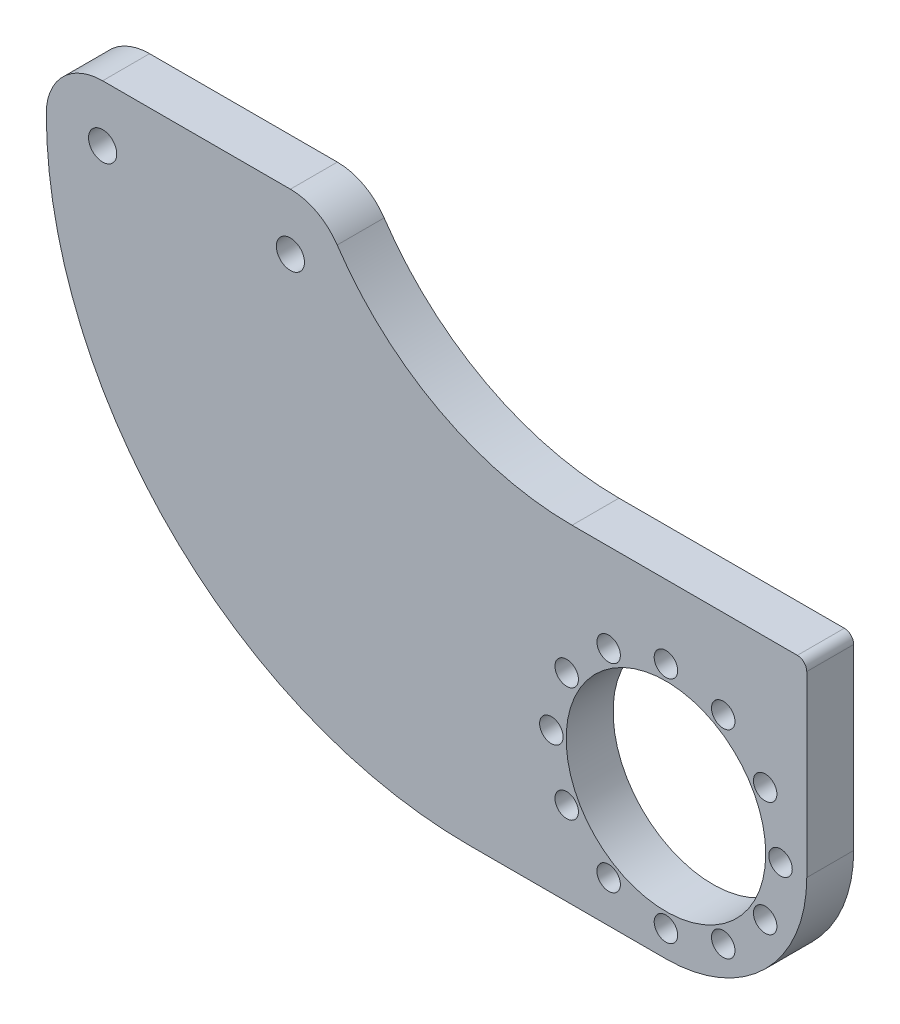
ISO-10303-21;
HEADER;
FILE_DESCRIPTION(('STEP AP214'),'2;1');
FILE_NAME('part.step','',(''),(''),'','','');
FILE_SCHEMA(('AUTOMOTIVE_DESIGN { 1 0 10303 214 1 1 1 1 }'));
ENDSEC;
DATA;
#1=APPLICATION_CONTEXT('core data for automotive mechanical design processes');
#2=APPLICATION_PROTOCOL_DEFINITION('international standard','automotive_design',2000,#1);
#3=PRODUCT_CONTEXT('',#1,'mechanical');
#4=PRODUCT('Part','Part','',(#3));
#5=PRODUCT_RELATED_PRODUCT_CATEGORY('part','',(#4));
#6=PRODUCT_DEFINITION_FORMATION('','',#4);
#7=PRODUCT_DEFINITION_CONTEXT('part definition',#1,'design');
#8=PRODUCT_DEFINITION('design','',#6,#7);
#9=PRODUCT_DEFINITION_SHAPE('','',#8);
#10=(LENGTH_UNIT() NAMED_UNIT(*) SI_UNIT(.MILLI.,.METRE.));
#11=(NAMED_UNIT(*) PLANE_ANGLE_UNIT() SI_UNIT($,.RADIAN.));
#12=(NAMED_UNIT(*) SI_UNIT($,.STERADIAN.) SOLID_ANGLE_UNIT());
#13=UNCERTAINTY_MEASURE_WITH_UNIT(LENGTH_MEASURE(1.E-05),#10,'distance_accuracy_value','');
#14=(GEOMETRIC_REPRESENTATION_CONTEXT(3) GLOBAL_UNCERTAINTY_ASSIGNED_CONTEXT((#13)) GLOBAL_UNIT_ASSIGNED_CONTEXT((#10,
#11,#12)) REPRESENTATION_CONTEXT('',''));
#15=CARTESIAN_POINT('',(0.,0.,0.));
#16=DIRECTION('',(0.,0.,1.));
#17=DIRECTION('',(1.,0.,0.));
#18=AXIS2_PLACEMENT_3D('',#15,#16,#17);
#19=CARTESIAN_POINT('',(17.78,24.13,6.35));
#20=DIRECTION('',(0.,0.,-1.));
#21=DIRECTION('',(-1.,0.,0.));
#22=AXIS2_PLACEMENT_3D('',#19,#20,#21);
#23=CYLINDRICAL_SURFACE('',#22,1.27);
#24=CARTESIAN_POINT('',(17.78,24.13,0.));
#25=DIRECTION('',(0.,0.,1.));
#26=DIRECTION('',(1.,0.,0.));
#27=AXIS2_PLACEMENT_3D('',#24,#25,#26);
#28=CIRCLE('',#27,1.27);
#29=CARTESIAN_POINT('',(17.78,25.4,0.));
#30=VERTEX_POINT('',#29);
#31=CARTESIAN_POINT('',(19.05,24.13,0.));
#32=VERTEX_POINT('',#31);
#33=EDGE_CURVE('E188',#30,#32,#28,.F.);
#34=ORIENTED_EDGE('',*,*,#33,.F.);
#35=DIRECTION('',(0.,0.,-1.));
#36=VECTOR('',#35,1.);
#37=CARTESIAN_POINT('',(17.78,25.4,6.35));
#38=LINE('',#37,#36);
#39=CARTESIAN_POINT('',(17.78,25.4,6.35));
#40=VERTEX_POINT('',#39);
#41=EDGE_CURVE('E11',#40,#30,#38,.T.);
#42=ORIENTED_EDGE('',*,*,#41,.F.);
#43=CARTESIAN_POINT('',(17.78,24.13,6.35));
#44=DIRECTION('',(0.,0.,1.));
#45=DIRECTION('',(1.,0.,0.));
#46=AXIS2_PLACEMENT_3D('',#43,#44,#45);
#47=CIRCLE('',#46,1.27);
#48=CARTESIAN_POINT('',(19.05,24.13,6.35));
#49=VERTEX_POINT('',#48);
#50=EDGE_CURVE('E564',#40,#49,#47,.F.);
#51=ORIENTED_EDGE('',*,*,#50,.T.);
#52=DIRECTION('',(0.,0.,-1.));
#53=VECTOR('',#52,1.);
#54=CARTESIAN_POINT('',(19.05,24.13,6.35));
#55=LINE('',#54,#53);
#56=EDGE_CURVE('E52',#49,#32,#55,.T.);
#57=ORIENTED_EDGE('',*,*,#56,.T.);
#58=EDGE_LOOP('',(#34,#42,#51,#57));
#59=FACE_BOUND('',#58,.T.);
#60=ADVANCED_FACE('F35',(#59),#23,.T.);
#61=CARTESIAN_POINT('',(0.,25.4,6.35));
#62=DIRECTION('',(0.,1.,0.));
#63=DIRECTION('',(0.,0.,1.));
#64=AXIS2_PLACEMENT_3D('',#61,#62,#63);
#65=PLANE('',#64);
#66=DIRECTION('',(1.,0.,0.));
#67=VECTOR('',#66,1.);
#68=CARTESIAN_POINT('',(0.,25.4,0.));
#69=LINE('',#68,#67);
#70=CARTESIAN_POINT('',(-12.7,25.4,0.));
#71=VERTEX_POINT('',#70);
#72=EDGE_CURVE('E190',#71,#30,#69,.T.);
#73=ORIENTED_EDGE('',*,*,#72,.F.);
#74=DIRECTION('',(0.,0.,-1.));
#75=VECTOR('',#74,1.);
#76=CARTESIAN_POINT('',(-12.7,25.4,6.35));
#77=LINE('',#76,#75);
#78=CARTESIAN_POINT('',(-12.7,25.4,6.35));
#79=VERTEX_POINT('',#78);
#80=EDGE_CURVE('E44',#79,#71,#77,.T.);
#81=ORIENTED_EDGE('',*,*,#80,.F.);
#82=DIRECTION('',(1.,0.,0.));
#83=VECTOR('',#82,1.);
#84=CARTESIAN_POINT('',(0.,25.4,6.35));
#85=LINE('',#84,#83);
#86=EDGE_CURVE('E250',#79,#40,#85,.T.);
#87=ORIENTED_EDGE('',*,*,#86,.T.);
#88=ORIENTED_EDGE('',*,*,#41,.T.);
#89=EDGE_LOOP('',(#73,#81,#87,#88));
#90=FACE_BOUND('',#89,.T.);
#91=ADVANCED_FACE('F249',(#90),#65,.T.);
#92=CARTESIAN_POINT('',(-12.7,63.65875,6.35));
#93=DIRECTION('',(0.,0.,-1.));
#94=DIRECTION('',(-1.,0.,0.));
#95=AXIS2_PLACEMENT_3D('',#92,#93,#94);
#96=CYLINDRICAL_SURFACE('',#95,38.25875);
#97=CARTESIAN_POINT('',(-12.7,63.65875,0.));
#98=DIRECTION('',(0.,0.,1.));
#99=DIRECTION('',(1.,0.,0.));
#100=AXIS2_PLACEMENT_3D('',#97,#98,#99);
#101=CIRCLE('',#100,38.25875);
#102=CARTESIAN_POINT('',(-44.4719723183391,42.3450519031142,0.));
#103=VERTEX_POINT('',#102);
#104=EDGE_CURVE('E193',#71,#103,#101,.F.);
#105=ORIENTED_EDGE('',*,*,#104,.T.);
#106=DIRECTION('',(0.,0.,-1.));
#107=VECTOR('',#106,1.);
#108=CARTESIAN_POINT('',(-44.4719723183391,42.3450519031142,6.35));
#109=LINE('',#108,#107);
#110=CARTESIAN_POINT('',(-44.4719723183391,42.3450519031142,6.35));
#111=VERTEX_POINT('',#110);
#112=EDGE_CURVE('E233',#111,#103,#109,.T.);
#113=ORIENTED_EDGE('',*,*,#112,.F.);
#114=CARTESIAN_POINT('',(-12.7,63.65875,6.35));
#115=DIRECTION('',(0.,0.,1.));
#116=DIRECTION('',(1.,0.,0.));
#117=AXIS2_PLACEMENT_3D('',#114,#115,#116);
#118=CIRCLE('',#117,38.25875);
#119=EDGE_CURVE('E241',#79,#111,#118,.F.);
#120=ORIENTED_EDGE('',*,*,#119,.F.);
#121=ORIENTED_EDGE('',*,*,#80,.T.);
#122=EDGE_LOOP('',(#105,#113,#120,#121));
#123=FACE_BOUND('',#122,.T.);
#124=ADVANCED_FACE('F238',(#123),#96,.F.);
#125=CARTESIAN_POINT('',(-50.8,38.1,6.35));
#126=DIRECTION('',(0.,0.,-1.));
#127=DIRECTION('',(-1.,0.,0.));
#128=AXIS2_PLACEMENT_3D('',#125,#126,#127);
#129=CYLINDRICAL_SURFACE('',#128,7.62);
#130=CARTESIAN_POINT('',(-50.8,38.1,0.));
#131=DIRECTION('',(0.,0.,1.));
#132=DIRECTION('',(1.,0.,0.));
#133=AXIS2_PLACEMENT_3D('',#130,#131,#132);
#134=CIRCLE('',#133,7.62);
#135=CARTESIAN_POINT('',(-50.8,45.72,0.));
#136=VERTEX_POINT('',#135);
#137=EDGE_CURVE('E196',#103,#136,#134,.T.);
#138=ORIENTED_EDGE('',*,*,#137,.T.);
#139=DIRECTION('',(0.,0.,-1.));
#140=VECTOR('',#139,1.);
#141=CARTESIAN_POINT('',(-50.8,45.72,6.35));
#142=LINE('',#141,#140);
#143=CARTESIAN_POINT('',(-50.8,45.72,6.35));
#144=VERTEX_POINT('',#143);
#145=EDGE_CURVE('E231',#144,#136,#142,.T.);
#146=ORIENTED_EDGE('',*,*,#145,.F.);
#147=CARTESIAN_POINT('',(-50.8,38.1,6.35));
#148=DIRECTION('',(0.,0.,1.));
#149=DIRECTION('',(1.,0.,0.));
#150=AXIS2_PLACEMENT_3D('',#147,#148,#149);
#151=CIRCLE('',#150,7.62);
#152=EDGE_CURVE('E558',#111,#144,#151,.T.);
#153=ORIENTED_EDGE('',*,*,#152,.F.);
#154=ORIENTED_EDGE('',*,*,#112,.T.);
#155=EDGE_LOOP('',(#138,#146,#153,#154));
#156=FACE_BOUND('',#155,.T.);
#157=ADVANCED_FACE('F396',(#156),#129,.T.);
#158=CARTESIAN_POINT('',(0.,45.72,6.35));
#159=DIRECTION('',(0.,1.,0.));
#160=DIRECTION('',(-1.,0.,0.));
#161=AXIS2_PLACEMENT_3D('',#158,#159,#160);
#162=PLANE('',#161);
#163=DIRECTION('',(1.,0.,0.));
#164=VECTOR('',#163,1.);
#165=CARTESIAN_POINT('',(0.,45.72,0.));
#166=LINE('',#165,#164);
#167=CARTESIAN_POINT('',(-76.2,45.72,0.));
#168=VERTEX_POINT('',#167);
#169=EDGE_CURVE('E199',#168,#136,#166,.T.);
#170=ORIENTED_EDGE('',*,*,#169,.F.);
#171=DIRECTION('',(0.,0.,-1.));
#172=VECTOR('',#171,1.);
#173=CARTESIAN_POINT('',(-76.2,45.72,6.35));
#174=LINE('',#173,#172);
#175=CARTESIAN_POINT('',(-76.2,45.72,6.35));
#176=VERTEX_POINT('',#175);
#177=EDGE_CURVE('E229',#176,#168,#174,.T.);
#178=ORIENTED_EDGE('',*,*,#177,.F.);
#179=DIRECTION('',(1.,0.,0.));
#180=VECTOR('',#179,1.);
#181=CARTESIAN_POINT('',(0.,45.72,6.35));
#182=LINE('',#181,#180);
#183=EDGE_CURVE('E557',#176,#144,#182,.T.);
#184=ORIENTED_EDGE('',*,*,#183,.T.);
#185=ORIENTED_EDGE('',*,*,#145,.T.);
#186=EDGE_LOOP('',(#170,#178,#184,#185));
#187=FACE_BOUND('',#186,.T.);
#188=ADVANCED_FACE('F392',(#187),#162,.T.);
#189=CARTESIAN_POINT('',(-76.2,38.1,6.35));
#190=DIRECTION('',(0.,0.,-1.));
#191=DIRECTION('',(-1.,0.,0.));
#192=AXIS2_PLACEMENT_3D('',#189,#190,#191);
#193=CYLINDRICAL_SURFACE('',#192,7.62);
#194=CARTESIAN_POINT('',(-76.2,38.1,0.));
#195=DIRECTION('',(0.,0.,1.));
#196=DIRECTION('',(1.,0.,0.));
#197=AXIS2_PLACEMENT_3D('',#194,#195,#196);
#198=CIRCLE('',#197,7.62);
#199=CARTESIAN_POINT('',(-83.82,38.1,0.));
#200=VERTEX_POINT('',#199);
#201=EDGE_CURVE('E202',#168,#200,#198,.T.);
#202=ORIENTED_EDGE('',*,*,#201,.T.);
#203=DIRECTION('',(0.,0.,-1.));
#204=VECTOR('',#203,1.);
#205=CARTESIAN_POINT('',(-83.82,38.1,6.35));
#206=LINE('',#205,#204);
#207=CARTESIAN_POINT('',(-83.82,38.1,6.35));
#208=VERTEX_POINT('',#207);
#209=EDGE_CURVE('E227',#208,#200,#206,.T.);
#210=ORIENTED_EDGE('',*,*,#209,.F.);
#211=CARTESIAN_POINT('',(-76.2,38.1,6.35));
#212=DIRECTION('',(0.,0.,1.));
#213=DIRECTION('',(1.,0.,0.));
#214=AXIS2_PLACEMENT_3D('',#211,#212,#213);
#215=CIRCLE('',#214,7.62);
#216=EDGE_CURVE('E138',#176,#208,#215,.T.);
#217=ORIENTED_EDGE('',*,*,#216,.F.);
#218=ORIENTED_EDGE('',*,*,#177,.T.);
#219=EDGE_LOOP('',(#202,#210,#217,#218));
#220=FACE_BOUND('',#219,.T.);
#221=ADVANCED_FACE('F388',(#220),#193,.T.);
#222=CARTESIAN_POINT('',(-26.67,38.1,6.35));
#223=DIRECTION('',(0.,0.,-1.));
#224=DIRECTION('',(-1.,0.,0.));
#225=AXIS2_PLACEMENT_3D('',#222,#223,#224);
#226=CYLINDRICAL_SURFACE('',#225,57.15);
#227=CARTESIAN_POINT('',(-26.67,38.1,0.));
#228=DIRECTION('',(0.,0.,1.));
#229=DIRECTION('',(1.,0.,0.));
#230=AXIS2_PLACEMENT_3D('',#227,#228,#229);
#231=CIRCLE('',#230,57.15);
#232=CARTESIAN_POINT('',(-26.67,-19.05,0.));
#233=VERTEX_POINT('',#232);
#234=EDGE_CURVE('E205',#233,#200,#231,.F.);
#235=ORIENTED_EDGE('',*,*,#234,.F.);
#236=DIRECTION('',(0.,0.,-1.));
#237=VECTOR('',#236,1.);
#238=CARTESIAN_POINT('',(-26.67,-19.05,6.35));
#239=LINE('',#238,#237);
#240=CARTESIAN_POINT('',(-26.67,-19.05,6.35));
#241=VERTEX_POINT('',#240);
#242=EDGE_CURVE('E124',#241,#233,#239,.T.);
#243=ORIENTED_EDGE('',*,*,#242,.F.);
#244=CARTESIAN_POINT('',(-26.67,38.1,6.35));
#245=DIRECTION('',(0.,0.,1.));
#246=DIRECTION('',(1.,0.,0.));
#247=AXIS2_PLACEMENT_3D('',#244,#245,#246);
#248=CIRCLE('',#247,57.15);
#249=EDGE_CURVE('E136',#241,#208,#248,.F.);
#250=ORIENTED_EDGE('',*,*,#249,.T.);
#251=ORIENTED_EDGE('',*,*,#209,.T.);
#252=EDGE_LOOP('',(#235,#243,#250,#251));
#253=FACE_BOUND('',#252,.T.);
#254=ADVANCED_FACE('F383',(#253),#226,.T.);
#255=CARTESIAN_POINT('',(0.,-19.05,6.35));
#256=DIRECTION('',(0.,-1.,0.));
#257=DIRECTION('',(1.,0.,0.));
#258=AXIS2_PLACEMENT_3D('',#255,#256,#257);
#259=PLANE('',#258);
#260=DIRECTION('',(-1.,0.,0.));
#261=VECTOR('',#260,1.);
#262=CARTESIAN_POINT('',(0.,-19.05,0.));
#263=LINE('',#262,#261);
#264=CARTESIAN_POINT('',(0.,-19.05,0.));
#265=VERTEX_POINT('',#264);
#266=EDGE_CURVE('E121',#265,#233,#263,.T.);
#267=ORIENTED_EDGE('',*,*,#266,.F.);
#268=DIRECTION('',(0.,0.,-1.));
#269=VECTOR('',#268,1.);
#270=CARTESIAN_POINT('',(0.,-19.05,6.35));
#271=LINE('',#270,#269);
#272=CARTESIAN_POINT('',(0.,-19.05,6.35));
#273=VERTEX_POINT('',#272);
#274=EDGE_CURVE('E115',#273,#265,#271,.T.);
#275=ORIENTED_EDGE('',*,*,#274,.F.);
#276=DIRECTION('',(-1.,0.,0.));
#277=VECTOR('',#276,1.);
#278=CARTESIAN_POINT('',(0.,-19.05,6.35));
#279=LINE('',#278,#277);
#280=EDGE_CURVE('E119',#273,#241,#279,.T.);
#281=ORIENTED_EDGE('',*,*,#280,.T.);
#282=ORIENTED_EDGE('',*,*,#242,.T.);
#283=EDGE_LOOP('',(#267,#275,#281,#282));
#284=FACE_BOUND('',#283,.T.);
#285=ADVANCED_FACE('F117',(#284),#259,.T.);
#286=CARTESIAN_POINT('',(0.,0.,6.35));
#287=DIRECTION('',(0.,0.,-1.));
#288=DIRECTION('',(-1.,0.,0.));
#289=AXIS2_PLACEMENT_3D('',#286,#287,#288);
#290=CYLINDRICAL_SURFACE('',#289,19.05);
#291=CARTESIAN_POINT('',(0.,0.,0.));
#292=DIRECTION('',(0.,0.,1.));
#293=DIRECTION('',(1.,0.,0.));
#294=AXIS2_PLACEMENT_3D('',#291,#292,#293);
#295=CIRCLE('',#294,19.05);
#296=CARTESIAN_POINT('',(19.05,0.,0.));
#297=VERTEX_POINT('',#296);
#298=EDGE_CURVE('E209',#265,#297,#295,.T.);
#299=ORIENTED_EDGE('',*,*,#298,.T.);
#300=DIRECTION('',(0.,0.,-1.));
#301=VECTOR('',#300,1.);
#302=CARTESIAN_POINT('',(19.05,0.,6.35));
#303=LINE('',#302,#301);
#304=CARTESIAN_POINT('',(19.05,0.,6.35));
#305=VERTEX_POINT('',#304);
#306=EDGE_CURVE('E84',#305,#297,#303,.T.);
#307=ORIENTED_EDGE('',*,*,#306,.F.);
#308=CARTESIAN_POINT('',(0.,0.,6.35));
#309=DIRECTION('',(0.,0.,1.));
#310=DIRECTION('',(1.,0.,0.));
#311=AXIS2_PLACEMENT_3D('',#308,#309,#310);
#312=CIRCLE('',#311,19.05);
#313=EDGE_CURVE('E126',#273,#305,#312,.T.);
#314=ORIENTED_EDGE('',*,*,#313,.F.);
#315=ORIENTED_EDGE('',*,*,#274,.T.);
#316=EDGE_LOOP('',(#299,#307,#314,#315));
#317=FACE_BOUND('',#316,.T.);
#318=ADVANCED_FACE('F127',(#317),#290,.T.);
#319=CARTESIAN_POINT('',(-76.2,38.1,6.35));
#320=DIRECTION('',(0.,0.,-1.));
#321=DIRECTION('',(-1.,0.,0.));
#322=AXIS2_PLACEMENT_3D('',#319,#320,#321);
#323=CYLINDRICAL_SURFACE('',#322,1.90500000000001);
#324=CARTESIAN_POINT('',(-76.2,38.1,6.35));
#325=DIRECTION('',(0.,0.,1.));
#326=DIRECTION('',(1.,0.,0.));
#327=AXIS2_PLACEMENT_3D('',#324,#325,#326);
#328=CIRCLE('',#327,1.90500000000001);
#329=CARTESIAN_POINT('',(-74.295,38.1,6.35));
#330=VERTEX_POINT('',#329);
#331=EDGE_CURVE('E146',#330,#330,#328,.T.);
#332=ORIENTED_EDGE('',*,*,#331,.T.);
#333=EDGE_LOOP('',(#332));
#334=FACE_BOUND('',#333,.T.);
#335=CARTESIAN_POINT('',(-76.2,38.1,0.));
#336=DIRECTION('',(0.,0.,1.));
#337=DIRECTION('',(1.,0.,0.));
#338=AXIS2_PLACEMENT_3D('',#335,#336,#337);
#339=CIRCLE('',#338,1.90500000000001);
#340=CARTESIAN_POINT('',(-74.295,38.1,0.));
#341=VERTEX_POINT('',#340);
#342=EDGE_CURVE('E217',#341,#341,#339,.T.);
#343=ORIENTED_EDGE('',*,*,#342,.F.);
#344=EDGE_LOOP('',(#343));
#345=FACE_BOUND('',#344,.T.);
#346=ADVANCED_FACE('F263',(#334,#345),#323,.F.);
#347=CARTESIAN_POINT('',(-50.8,38.1,6.35));
#348=DIRECTION('',(0.,0.,-1.));
#349=DIRECTION('',(-1.,0.,0.));
#350=AXIS2_PLACEMENT_3D('',#347,#348,#349);
#351=CYLINDRICAL_SURFACE('',#350,1.905);
#352=CARTESIAN_POINT('',(-50.8,38.1,6.35));
#353=DIRECTION('',(0.,0.,1.));
#354=DIRECTION('',(1.,0.,0.));
#355=AXIS2_PLACEMENT_3D('',#352,#353,#354);
#356=CIRCLE('',#355,1.905);
#357=CARTESIAN_POINT('',(-48.895,38.1,6.35));
#358=VERTEX_POINT('',#357);
#359=EDGE_CURVE('E143',#358,#358,#356,.T.);
#360=ORIENTED_EDGE('',*,*,#359,.T.);
#361=EDGE_LOOP('',(#360));
#362=FACE_BOUND('',#361,.T.);
#363=CARTESIAN_POINT('',(-50.8,38.1,0.));
#364=DIRECTION('',(0.,0.,1.));
#365=DIRECTION('',(1.,0.,0.));
#366=AXIS2_PLACEMENT_3D('',#363,#364,#365);
#367=CIRCLE('',#366,1.905);
#368=CARTESIAN_POINT('',(-48.895,38.1,0.));
#369=VERTEX_POINT('',#368);
#370=EDGE_CURVE('E214',#369,#369,#367,.T.);
#371=ORIENTED_EDGE('',*,*,#370,.F.);
#372=EDGE_LOOP('',(#371));
#373=FACE_BOUND('',#372,.T.);
#374=ADVANCED_FACE('F254',(#362,#373),#351,.F.);
#375=CARTESIAN_POINT('',(19.05,0.,6.35));
#376=DIRECTION('',(1.,0.,0.));
#377=DIRECTION('',(0.,1.,0.));
#378=AXIS2_PLACEMENT_3D('',#375,#376,#377);
#379=PLANE('',#378);
#380=DIRECTION('',(0.,-1.,0.));
#381=VECTOR('',#380,1.);
#382=CARTESIAN_POINT('',(19.05,0.,0.));
#383=LINE('',#382,#381);
#384=EDGE_CURVE('E211',#32,#297,#383,.T.);
#385=ORIENTED_EDGE('',*,*,#384,.F.);
#386=ORIENTED_EDGE('',*,*,#56,.F.);
#387=DIRECTION('',(0.,-1.,0.));
#388=VECTOR('',#387,1.);
#389=CARTESIAN_POINT('',(19.05,0.,6.35));
#390=LINE('',#389,#388);
#391=EDGE_CURVE('E130',#49,#305,#390,.T.);
#392=ORIENTED_EDGE('',*,*,#391,.T.);
#393=ORIENTED_EDGE('',*,*,#306,.T.);
#394=EDGE_LOOP('',(#385,#386,#392,#393));
#395=FACE_BOUND('',#394,.T.);
#396=ADVANCED_FACE('F251',(#395),#379,.T.);
#397=CARTESIAN_POINT('',(0.,15.50035,6.35));
#398=DIRECTION('',(0.,0.,-1.));
#399=DIRECTION('',(-1.,0.,0.));
#400=AXIS2_PLACEMENT_3D('',#397,#398,#399);
#401=CYLINDRICAL_SURFACE('',#400,1.5875);
#402=CARTESIAN_POINT('',(0.,15.50035,6.35));
#403=DIRECTION('',(0.,0.,1.));
#404=DIRECTION('',(1.,0.,0.));
#405=AXIS2_PLACEMENT_3D('',#402,#403,#404);
#406=CIRCLE('',#405,1.5875);
#407=CARTESIAN_POINT('',(1.5875,15.50035,6.35));
#408=VERTEX_POINT('',#407);
#409=EDGE_CURVE('E566',#408,#408,#406,.T.);
#410=ORIENTED_EDGE('',*,*,#409,.T.);
#411=EDGE_LOOP('',(#410));
#412=FACE_BOUND('',#411,.T.);
#413=CARTESIAN_POINT('',(0.,15.50035,0.));
#414=DIRECTION('',(0.,0.,1.));
#415=DIRECTION('',(1.,0.,0.));
#416=AXIS2_PLACEMENT_3D('',#413,#414,#415);
#417=CIRCLE('',#416,1.5875);
#418=CARTESIAN_POINT('',(1.5875,15.50035,0.));
#419=VERTEX_POINT('',#418);
#420=EDGE_CURVE('E185',#419,#419,#417,.T.);
#421=ORIENTED_EDGE('',*,*,#420,.F.);
#422=EDGE_LOOP('',(#421));
#423=FACE_BOUND('',#422,.T.);
#424=ADVANCED_FACE('F253',(#412,#423),#401,.F.);
#425=CARTESIAN_POINT('',(7.75017500000002,13.4236968675501,6.35));
#426=DIRECTION('',(0.,0.,-1.));
#427=DIRECTION('',(-1.,0.,0.));
#428=AXIS2_PLACEMENT_3D('',#425,#426,#427);
#429=CYLINDRICAL_SURFACE('',#428,1.5875);
#430=CARTESIAN_POINT('',(7.75017500000002,13.4236968675501,6.35));
#431=DIRECTION('',(0.,0.,1.));
#432=DIRECTION('',(1.,0.,0.));
#433=AXIS2_PLACEMENT_3D('',#430,#431,#432);
#434=CIRCLE('',#433,1.5875);
#435=CARTESIAN_POINT('',(9.33767500000001,13.4236968675501,6.35));
#436=VERTEX_POINT('',#435);
#437=EDGE_CURVE('E569',#436,#436,#434,.T.);
#438=ORIENTED_EDGE('',*,*,#437,.T.);
#439=EDGE_LOOP('',(#438));
#440=FACE_BOUND('',#439,.T.);
#441=CARTESIAN_POINT('',(7.75017500000002,13.4236968675501,0.));
#442=DIRECTION('',(0.,0.,1.));
#443=DIRECTION('',(1.,0.,0.));
#444=AXIS2_PLACEMENT_3D('',#441,#442,#443);
#445=CIRCLE('',#444,1.5875);
#446=CARTESIAN_POINT('',(9.33767500000001,13.4236968675501,0.));
#447=VERTEX_POINT('',#446);
#448=EDGE_CURVE('E182',#447,#447,#445,.T.);
#449=ORIENTED_EDGE('',*,*,#448,.F.);
#450=EDGE_LOOP('',(#449));
#451=FACE_BOUND('',#450,.T.);
#452=ADVANCED_FACE('F260',(#440,#451),#429,.F.);
#453=CARTESIAN_POINT('',(13.4236968675501,7.75017499999997,6.35));
#454=DIRECTION('',(0.,0.,-1.));
#455=DIRECTION('',(-1.,0.,0.));
#456=AXIS2_PLACEMENT_3D('',#453,#454,#455);
#457=CYLINDRICAL_SURFACE('',#456,1.5875);
#458=CARTESIAN_POINT('',(13.4236968675501,7.75017499999997,6.35));
#459=DIRECTION('',(0.,0.,1.));
#460=DIRECTION('',(1.,0.,0.));
#461=AXIS2_PLACEMENT_3D('',#458,#459,#460);
#462=CIRCLE('',#461,1.5875);
#463=CARTESIAN_POINT('',(15.0111968675501,7.75017499999997,6.35));
#464=VERTEX_POINT('',#463);
#465=EDGE_CURVE('E572',#464,#464,#462,.T.);
#466=ORIENTED_EDGE('',*,*,#465,.T.);
#467=EDGE_LOOP('',(#466));
#468=FACE_BOUND('',#467,.T.);
#469=CARTESIAN_POINT('',(13.4236968675501,7.75017499999997,0.));
#470=DIRECTION('',(0.,0.,1.));
#471=DIRECTION('',(1.,0.,0.));
#472=AXIS2_PLACEMENT_3D('',#469,#470,#471);
#473=CIRCLE('',#472,1.5875);
#474=CARTESIAN_POINT('',(15.0111968675501,7.75017499999997,0.));
#475=VERTEX_POINT('',#474);
#476=EDGE_CURVE('E179',#475,#475,#473,.T.);
#477=ORIENTED_EDGE('',*,*,#476,.F.);
#478=EDGE_LOOP('',(#477));
#479=FACE_BOUND('',#478,.T.);
#480=ADVANCED_FACE('F277',(#468,#479),#457,.F.);
#481=CARTESIAN_POINT('',(15.50035,0.,6.35));
#482=DIRECTION('',(0.,0.,-1.));
#483=DIRECTION('',(-1.,0.,0.));
#484=AXIS2_PLACEMENT_3D('',#481,#482,#483);
#485=CYLINDRICAL_SURFACE('',#484,1.5875);
#486=CARTESIAN_POINT('',(15.50035,0.,6.35));
#487=DIRECTION('',(0.,0.,1.));
#488=DIRECTION('',(1.,0.,0.));
#489=AXIS2_PLACEMENT_3D('',#486,#487,#488);
#490=CIRCLE('',#489,1.5875);
#491=CARTESIAN_POINT('',(17.08785,0.,6.35));
#492=VERTEX_POINT('',#491);
#493=EDGE_CURVE('E575',#492,#492,#490,.T.);
#494=ORIENTED_EDGE('',*,*,#493,.T.);
#495=EDGE_LOOP('',(#494));
#496=FACE_BOUND('',#495,.T.);
#497=CARTESIAN_POINT('',(15.50035,0.,0.));
#498=DIRECTION('',(0.,0.,1.));
#499=DIRECTION('',(1.,0.,0.));
#500=AXIS2_PLACEMENT_3D('',#497,#498,#499);
#501=CIRCLE('',#500,1.5875);
#502=CARTESIAN_POINT('',(17.08785,0.,0.));
#503=VERTEX_POINT('',#502);
#504=EDGE_CURVE('E176',#503,#503,#501,.T.);
#505=ORIENTED_EDGE('',*,*,#504,.F.);
#506=EDGE_LOOP('',(#505));
#507=FACE_BOUND('',#506,.T.);
#508=ADVANCED_FACE('F281',(#496,#507),#485,.F.);
#509=CARTESIAN_POINT('',(13.4236968675501,-7.75017500000006,6.35));
#510=DIRECTION('',(0.,0.,-1.));
#511=DIRECTION('',(-1.,0.,0.));
#512=AXIS2_PLACEMENT_3D('',#509,#510,#511);
#513=CYLINDRICAL_SURFACE('',#512,1.5875);
#514=CARTESIAN_POINT('',(13.4236968675501,-7.75017500000006,6.35));
#515=DIRECTION('',(0.,0.,1.));
#516=DIRECTION('',(1.,0.,0.));
#517=AXIS2_PLACEMENT_3D('',#514,#515,#516);
#518=CIRCLE('',#517,1.5875);
#519=CARTESIAN_POINT('',(15.0111968675501,-7.75017500000006,6.35));
#520=VERTEX_POINT('',#519);
#521=EDGE_CURVE('E578',#520,#520,#518,.T.);
#522=ORIENTED_EDGE('',*,*,#521,.T.);
#523=EDGE_LOOP('',(#522));
#524=FACE_BOUND('',#523,.T.);
#525=CARTESIAN_POINT('',(13.4236968675501,-7.75017500000006,0.));
#526=DIRECTION('',(0.,0.,1.));
#527=DIRECTION('',(1.,0.,0.));
#528=AXIS2_PLACEMENT_3D('',#525,#526,#527);
#529=CIRCLE('',#528,1.5875);
#530=CARTESIAN_POINT('',(15.0111968675501,-7.75017500000006,0.));
#531=VERTEX_POINT('',#530);
#532=EDGE_CURVE('E173',#531,#531,#529,.T.);
#533=ORIENTED_EDGE('',*,*,#532,.F.);
#534=EDGE_LOOP('',(#533));
#535=FACE_BOUND('',#534,.T.);
#536=ADVANCED_FACE('F285',(#524,#535),#513,.F.);
#537=CARTESIAN_POINT('',(7.75017500000164,-13.4236968675497,6.35));
#538=DIRECTION('',(0.,0.,-1.));
#539=DIRECTION('',(-1.,0.,0.));
#540=AXIS2_PLACEMENT_3D('',#537,#538,#539);
#541=CYLINDRICAL_SURFACE('',#540,1.58750000000153);
#542=CARTESIAN_POINT('',(7.75017500000164,-13.4236968675497,6.35));
#543=DIRECTION('',(0.,0.,1.));
#544=DIRECTION('',(1.,0.,0.));
#545=AXIS2_PLACEMENT_3D('',#542,#543,#544);
#546=CIRCLE('',#545,1.58750000000153);
#547=CARTESIAN_POINT('',(9.33767500000318,-13.4236968675497,6.35));
#548=VERTEX_POINT('',#547);
#549=EDGE_CURVE('E581',#548,#548,#546,.T.);
#550=ORIENTED_EDGE('',*,*,#549,.T.);
#551=EDGE_LOOP('',(#550));
#552=FACE_BOUND('',#551,.T.);
#553=CARTESIAN_POINT('',(7.75017500000164,-13.4236968675497,0.));
#554=DIRECTION('',(0.,0.,1.));
#555=DIRECTION('',(1.,0.,0.));
#556=AXIS2_PLACEMENT_3D('',#553,#554,#555);
#557=CIRCLE('',#556,1.58750000000153);
#558=CARTESIAN_POINT('',(9.33767500000318,-13.4236968675497,0.));
#559=VERTEX_POINT('',#558);
#560=EDGE_CURVE('E170',#559,#559,#557,.T.);
#561=ORIENTED_EDGE('',*,*,#560,.F.);
#562=EDGE_LOOP('',(#561));
#563=FACE_BOUND('',#562,.T.);
#564=ADVANCED_FACE('F289',(#552,#563),#541,.F.);
#565=CARTESIAN_POINT('',(1.75838928427562E-12,-15.50035,6.35));
#566=DIRECTION('',(0.,0.,-1.));
#567=DIRECTION('',(-1.,0.,0.));
#568=AXIS2_PLACEMENT_3D('',#565,#566,#567);
#569=CYLINDRICAL_SURFACE('',#568,1.58750000000179);
#570=CARTESIAN_POINT('',(1.75838928427562E-12,-15.50035,6.35));
#571=DIRECTION('',(0.,0.,1.));
#572=DIRECTION('',(1.,0.,0.));
#573=AXIS2_PLACEMENT_3D('',#570,#571,#572);
#574=CIRCLE('',#573,1.58750000000179);
#575=CARTESIAN_POINT('',(1.58750000000354,-15.50035,6.35));
#576=VERTEX_POINT('',#575);
#577=EDGE_CURVE('E584',#576,#576,#574,.T.);
#578=ORIENTED_EDGE('',*,*,#577,.T.);
#579=EDGE_LOOP('',(#578));
#580=FACE_BOUND('',#579,.T.);
#581=CARTESIAN_POINT('',(1.75838928427562E-12,-15.50035,0.));
#582=DIRECTION('',(0.,0.,1.));
#583=DIRECTION('',(1.,0.,0.));
#584=AXIS2_PLACEMENT_3D('',#581,#582,#583);
#585=CIRCLE('',#584,1.58750000000179);
#586=CARTESIAN_POINT('',(1.58750000000354,-15.50035,0.));
#587=VERTEX_POINT('',#586);
#588=EDGE_CURVE('E167',#587,#587,#585,.T.);
#589=ORIENTED_EDGE('',*,*,#588,.F.);
#590=EDGE_LOOP('',(#589));
#591=FACE_BOUND('',#590,.T.);
#592=ADVANCED_FACE('F293',(#580,#591),#569,.F.);
#593=CARTESIAN_POINT('',(-7.75017499999836,-13.4236968675506,6.35));
#594=DIRECTION('',(0.,0.,-1.));
#595=DIRECTION('',(-1.,0.,0.));
#596=AXIS2_PLACEMENT_3D('',#593,#594,#595);
#597=CYLINDRICAL_SURFACE('',#596,1.58750000000182);
#598=CARTESIAN_POINT('',(-7.75017499999836,-13.4236968675506,6.35));
#599=DIRECTION('',(0.,0.,1.));
#600=DIRECTION('',(1.,0.,0.));
#601=AXIS2_PLACEMENT_3D('',#598,#599,#600);
#602=CIRCLE('',#601,1.58750000000182);
#603=CARTESIAN_POINT('',(-6.16267499999653,-13.4236968675506,6.35));
#604=VERTEX_POINT('',#603);
#605=EDGE_CURVE('E587',#604,#604,#602,.T.);
#606=ORIENTED_EDGE('',*,*,#605,.T.);
#607=EDGE_LOOP('',(#606));
#608=FACE_BOUND('',#607,.T.);
#609=CARTESIAN_POINT('',(-7.75017499999836,-13.4236968675506,0.));
#610=DIRECTION('',(0.,0.,1.));
#611=DIRECTION('',(1.,0.,0.));
#612=AXIS2_PLACEMENT_3D('',#609,#610,#611);
#613=CIRCLE('',#612,1.58750000000182);
#614=CARTESIAN_POINT('',(-6.16267499999653,-13.4236968675506,0.));
#615=VERTEX_POINT('',#614);
#616=EDGE_CURVE('E164',#615,#615,#613,.T.);
#617=ORIENTED_EDGE('',*,*,#616,.F.);
#618=EDGE_LOOP('',(#617));
#619=FACE_BOUND('',#618,.T.);
#620=ADVANCED_FACE('F297',(#608,#619),#597,.F.);
#621=CARTESIAN_POINT('',(-13.4236968675502,-7.75017499999987,6.35));
#622=DIRECTION('',(0.,0.,-1.));
#623=DIRECTION('',(-1.,0.,0.));
#624=AXIS2_PLACEMENT_3D('',#621,#622,#623);
#625=CYLINDRICAL_SURFACE('',#624,1.5875);
#626=CARTESIAN_POINT('',(-13.4236968675502,-7.75017499999987,6.35));
#627=DIRECTION('',(0.,0.,1.));
#628=DIRECTION('',(1.,0.,0.));
#629=AXIS2_PLACEMENT_3D('',#626,#627,#628);
#630=CIRCLE('',#629,1.5875);
#631=CARTESIAN_POINT('',(-11.8361968675502,-7.75017499999987,6.35));
#632=VERTEX_POINT('',#631);
#633=EDGE_CURVE('E590',#632,#632,#630,.T.);
#634=ORIENTED_EDGE('',*,*,#633,.T.);
#635=EDGE_LOOP('',(#634));
#636=FACE_BOUND('',#635,.T.);
#637=CARTESIAN_POINT('',(-13.4236968675502,-7.75017499999987,0.));
#638=DIRECTION('',(0.,0.,1.));
#639=DIRECTION('',(1.,0.,0.));
#640=AXIS2_PLACEMENT_3D('',#637,#638,#639);
#641=CIRCLE('',#640,1.5875);
#642=CARTESIAN_POINT('',(-11.8361968675502,-7.75017499999987,0.));
#643=VERTEX_POINT('',#642);
#644=EDGE_CURVE('E161',#643,#643,#641,.T.);
#645=ORIENTED_EDGE('',*,*,#644,.F.);
#646=EDGE_LOOP('',(#645));
#647=FACE_BOUND('',#646,.T.);
#648=ADVANCED_FACE('F301',(#636,#647),#625,.F.);
#649=CARTESIAN_POINT('',(-15.50035,1.62357548311611E-13,6.35));
#650=DIRECTION('',(0.,0.,-1.));
#651=DIRECTION('',(-1.,0.,0.));
#652=AXIS2_PLACEMENT_3D('',#649,#650,#651);
#653=CYLINDRICAL_SURFACE('',#652,1.5875);
#654=CARTESIAN_POINT('',(-15.50035,1.62357548311611E-13,6.35));
#655=DIRECTION('',(0.,0.,1.));
#656=DIRECTION('',(1.,0.,0.));
#657=AXIS2_PLACEMENT_3D('',#654,#655,#656);
#658=CIRCLE('',#657,1.5875);
#659=CARTESIAN_POINT('',(-13.91285,1.62357548311611E-13,6.35));
#660=VERTEX_POINT('',#659);
#661=EDGE_CURVE('E593',#660,#660,#658,.T.);
#662=ORIENTED_EDGE('',*,*,#661,.T.);
#663=EDGE_LOOP('',(#662));
#664=FACE_BOUND('',#663,.T.);
#665=CARTESIAN_POINT('',(-15.50035,1.62357548311611E-13,0.));
#666=DIRECTION('',(0.,0.,1.));
#667=DIRECTION('',(1.,0.,0.));
#668=AXIS2_PLACEMENT_3D('',#665,#666,#667);
#669=CIRCLE('',#668,1.5875);
#670=CARTESIAN_POINT('',(-13.91285,1.62357548311611E-13,0.));
#671=VERTEX_POINT('',#670);
#672=EDGE_CURVE('E158',#671,#671,#669,.T.);
#673=ORIENTED_EDGE('',*,*,#672,.F.);
#674=EDGE_LOOP('',(#673));
#675=FACE_BOUND('',#674,.T.);
#676=ADVANCED_FACE('F305',(#664,#675),#653,.F.);
#677=CARTESIAN_POINT('',(-13.42369686755,7.75017500000016,6.35));
#678=DIRECTION('',(0.,0.,-1.));
#679=DIRECTION('',(-1.,0.,0.));
#680=AXIS2_PLACEMENT_3D('',#677,#678,#679);
#681=CYLINDRICAL_SURFACE('',#680,1.5875);
#682=CARTESIAN_POINT('',(-13.42369686755,7.75017500000016,6.35));
#683=DIRECTION('',(0.,0.,1.));
#684=DIRECTION('',(1.,0.,0.));
#685=AXIS2_PLACEMENT_3D('',#682,#683,#684);
#686=CIRCLE('',#685,1.5875);
#687=CARTESIAN_POINT('',(-11.83619686755,7.75017500000016,6.35));
#688=VERTEX_POINT('',#687);
#689=EDGE_CURVE('E320',#688,#688,#686,.T.);
#690=ORIENTED_EDGE('',*,*,#689,.T.);
#691=EDGE_LOOP('',(#690));
#692=FACE_BOUND('',#691,.T.);
#693=CARTESIAN_POINT('',(-13.42369686755,7.75017500000016,0.));
#694=DIRECTION('',(0.,0.,1.));
#695=DIRECTION('',(1.,0.,0.));
#696=AXIS2_PLACEMENT_3D('',#693,#694,#695);
#697=CIRCLE('',#696,1.5875);
#698=CARTESIAN_POINT('',(-11.83619686755,7.75017500000016,0.));
#699=VERTEX_POINT('',#698);
#700=EDGE_CURVE('E155',#699,#699,#697,.T.);
#701=ORIENTED_EDGE('',*,*,#700,.F.);
#702=EDGE_LOOP('',(#701));
#703=FACE_BOUND('',#702,.T.);
#704=ADVANCED_FACE('F308',(#692,#703),#681,.F.);
#705=CARTESIAN_POINT('',(-7.75017499999983,13.4236968675502,6.35));
#706=DIRECTION('',(0.,0.,-1.));
#707=DIRECTION('',(-1.,0.,0.));
#708=AXIS2_PLACEMENT_3D('',#705,#706,#707);
#709=CYLINDRICAL_SURFACE('',#708,1.5875);
#710=CARTESIAN_POINT('',(-7.75017499999983,13.4236968675502,6.35));
#711=DIRECTION('',(0.,0.,1.));
#712=DIRECTION('',(1.,0.,0.));
#713=AXIS2_PLACEMENT_3D('',#710,#711,#712);
#714=CIRCLE('',#713,1.5875);
#715=CARTESIAN_POINT('',(-6.16267499999983,13.4236968675502,6.35));
#716=VERTEX_POINT('',#715);
#717=EDGE_CURVE('E223',#716,#716,#714,.T.);
#718=ORIENTED_EDGE('',*,*,#717,.T.);
#719=EDGE_LOOP('',(#718));
#720=FACE_BOUND('',#719,.T.);
#721=CARTESIAN_POINT('',(-7.75017499999983,13.4236968675502,0.));
#722=DIRECTION('',(0.,0.,1.));
#723=DIRECTION('',(1.,0.,0.));
#724=AXIS2_PLACEMENT_3D('',#721,#722,#723);
#725=CIRCLE('',#724,1.5875);
#726=CARTESIAN_POINT('',(-6.16267499999983,13.4236968675502,0.));
#727=VERTEX_POINT('',#726);
#728=EDGE_CURVE('E152',#727,#727,#725,.T.);
#729=ORIENTED_EDGE('',*,*,#728,.F.);
#730=EDGE_LOOP('',(#729));
#731=FACE_BOUND('',#730,.T.);
#732=ADVANCED_FACE('F37',(#720,#731),#709,.F.);
#733=CARTESIAN_POINT('',(0.,0.,6.35));
#734=DIRECTION('',(0.,0.,-1.));
#735=DIRECTION('',(-1.,0.,0.));
#736=AXIS2_PLACEMENT_3D('',#733,#734,#735);
#737=CYLINDRICAL_SURFACE('',#736,13.5001);
#738=CARTESIAN_POINT('',(0.,0.,6.35));
#739=DIRECTION('',(0.,0.,1.));
#740=DIRECTION('',(1.,0.,0.));
#741=AXIS2_PLACEMENT_3D('',#738,#739,#740);
#742=CIRCLE('',#741,13.5001);
#743=CARTESIAN_POINT('',(13.5001,0.,6.35));
#744=VERTEX_POINT('',#743);
#745=EDGE_CURVE('E149',#744,#744,#742,.T.);
#746=ORIENTED_EDGE('',*,*,#745,.T.);
#747=EDGE_LOOP('',(#746));
#748=FACE_BOUND('',#747,.T.);
#749=CARTESIAN_POINT('',(0.,0.,0.));
#750=DIRECTION('',(0.,0.,1.));
#751=DIRECTION('',(1.,0.,0.));
#752=AXIS2_PLACEMENT_3D('',#749,#750,#751);
#753=CIRCLE('',#752,13.5001);
#754=CARTESIAN_POINT('',(13.5001,0.,0.));
#755=VERTEX_POINT('',#754);
#756=EDGE_CURVE('E220',#755,#755,#753,.T.);
#757=ORIENTED_EDGE('',*,*,#756,.F.);
#758=EDGE_LOOP('',(#757));
#759=FACE_BOUND('',#758,.T.);
#760=ADVANCED_FACE('F315',(#748,#759),#737,.F.);
#761=CARTESIAN_POINT('',(0.,0.,6.35));
#762=DIRECTION('',(0.,0.,1.));
#763=DIRECTION('',(1.,0.,0.));
#764=AXIS2_PLACEMENT_3D('',#761,#762,#763);
#765=PLANE('',#764);
#766=ORIENTED_EDGE('',*,*,#717,.F.);
#767=EDGE_LOOP('',(#766));
#768=FACE_BOUND('',#767,.T.);
#769=ORIENTED_EDGE('',*,*,#689,.F.);
#770=EDGE_LOOP('',(#769));
#771=FACE_BOUND('',#770,.T.);
#772=ORIENTED_EDGE('',*,*,#661,.F.);
#773=EDGE_LOOP('',(#772));
#774=FACE_BOUND('',#773,.T.);
#775=ORIENTED_EDGE('',*,*,#633,.F.);
#776=EDGE_LOOP('',(#775));
#777=FACE_BOUND('',#776,.T.);
#778=ORIENTED_EDGE('',*,*,#605,.F.);
#779=EDGE_LOOP('',(#778));
#780=FACE_BOUND('',#779,.T.);
#781=ORIENTED_EDGE('',*,*,#577,.F.);
#782=EDGE_LOOP('',(#781));
#783=FACE_BOUND('',#782,.T.);
#784=ORIENTED_EDGE('',*,*,#549,.F.);
#785=EDGE_LOOP('',(#784));
#786=FACE_BOUND('',#785,.T.);
#787=ORIENTED_EDGE('',*,*,#521,.F.);
#788=EDGE_LOOP('',(#787));
#789=FACE_BOUND('',#788,.T.);
#790=ORIENTED_EDGE('',*,*,#493,.F.);
#791=EDGE_LOOP('',(#790));
#792=FACE_BOUND('',#791,.T.);
#793=ORIENTED_EDGE('',*,*,#465,.F.);
#794=EDGE_LOOP('',(#793));
#795=FACE_BOUND('',#794,.T.);
#796=ORIENTED_EDGE('',*,*,#437,.F.);
#797=EDGE_LOOP('',(#796));
#798=FACE_BOUND('',#797,.T.);
#799=ORIENTED_EDGE('',*,*,#409,.F.);
#800=EDGE_LOOP('',(#799));
#801=FACE_BOUND('',#800,.T.);
#802=ORIENTED_EDGE('',*,*,#50,.F.);
#803=ORIENTED_EDGE('',*,*,#86,.F.);
#804=ORIENTED_EDGE('',*,*,#119,.T.);
#805=ORIENTED_EDGE('',*,*,#152,.T.);
#806=ORIENTED_EDGE('',*,*,#183,.F.);
#807=ORIENTED_EDGE('',*,*,#216,.T.);
#808=ORIENTED_EDGE('',*,*,#249,.F.);
#809=ORIENTED_EDGE('',*,*,#280,.F.);
#810=ORIENTED_EDGE('',*,*,#313,.T.);
#811=ORIENTED_EDGE('',*,*,#391,.F.);
#812=EDGE_LOOP('',(#802,#803,#804,#805,#806,#807,#808,#809,#810,#811));
#813=FACE_BOUND('',#812,.T.);
#814=ORIENTED_EDGE('',*,*,#359,.F.);
#815=EDGE_LOOP('',(#814));
#816=FACE_BOUND('',#815,.T.);
#817=ORIENTED_EDGE('',*,*,#331,.F.);
#818=EDGE_LOOP('',(#817));
#819=FACE_BOUND('',#818,.T.);
#820=ORIENTED_EDGE('',*,*,#745,.F.);
#821=EDGE_LOOP('',(#820));
#822=FACE_BOUND('',#821,.T.);
#823=ADVANCED_FACE('F133',(#768,#771,#774,#777,#780,#783,#786,#789,#792,#795,#798,#801,#813,
#816,#819,#822),#765,.T.);
#824=CARTESIAN_POINT('',(0.,0.,0.));
#825=DIRECTION('',(0.,0.,1.));
#826=DIRECTION('',(1.,0.,0.));
#827=AXIS2_PLACEMENT_3D('',#824,#825,#826);
#828=PLANE('',#827);
#829=ORIENTED_EDGE('',*,*,#728,.T.);
#830=EDGE_LOOP('',(#829));
#831=FACE_BOUND('',#830,.T.);
#832=ORIENTED_EDGE('',*,*,#700,.T.);
#833=EDGE_LOOP('',(#832));
#834=FACE_BOUND('',#833,.T.);
#835=ORIENTED_EDGE('',*,*,#672,.T.);
#836=EDGE_LOOP('',(#835));
#837=FACE_BOUND('',#836,.T.);
#838=ORIENTED_EDGE('',*,*,#644,.T.);
#839=EDGE_LOOP('',(#838));
#840=FACE_BOUND('',#839,.T.);
#841=ORIENTED_EDGE('',*,*,#616,.T.);
#842=EDGE_LOOP('',(#841));
#843=FACE_BOUND('',#842,.T.);
#844=ORIENTED_EDGE('',*,*,#588,.T.);
#845=EDGE_LOOP('',(#844));
#846=FACE_BOUND('',#845,.T.);
#847=ORIENTED_EDGE('',*,*,#560,.T.);
#848=EDGE_LOOP('',(#847));
#849=FACE_BOUND('',#848,.T.);
#850=ORIENTED_EDGE('',*,*,#532,.T.);
#851=EDGE_LOOP('',(#850));
#852=FACE_BOUND('',#851,.T.);
#853=ORIENTED_EDGE('',*,*,#504,.T.);
#854=EDGE_LOOP('',(#853));
#855=FACE_BOUND('',#854,.T.);
#856=ORIENTED_EDGE('',*,*,#476,.T.);
#857=EDGE_LOOP('',(#856));
#858=FACE_BOUND('',#857,.T.);
#859=ORIENTED_EDGE('',*,*,#448,.T.);
#860=EDGE_LOOP('',(#859));
#861=FACE_BOUND('',#860,.T.);
#862=ORIENTED_EDGE('',*,*,#420,.T.);
#863=EDGE_LOOP('',(#862));
#864=FACE_BOUND('',#863,.T.);
#865=ORIENTED_EDGE('',*,*,#33,.T.);
#866=ORIENTED_EDGE('',*,*,#384,.T.);
#867=ORIENTED_EDGE('',*,*,#298,.F.);
#868=ORIENTED_EDGE('',*,*,#266,.T.);
#869=ORIENTED_EDGE('',*,*,#234,.T.);
#870=ORIENTED_EDGE('',*,*,#201,.F.);
#871=ORIENTED_EDGE('',*,*,#169,.T.);
#872=ORIENTED_EDGE('',*,*,#137,.F.);
#873=ORIENTED_EDGE('',*,*,#104,.F.);
#874=ORIENTED_EDGE('',*,*,#72,.T.);
#875=EDGE_LOOP('',(#865,#866,#867,#868,#869,#870,#871,#872,#873,#874));
#876=FACE_BOUND('',#875,.T.);
#877=ORIENTED_EDGE('',*,*,#370,.T.);
#878=EDGE_LOOP('',(#877));
#879=FACE_BOUND('',#878,.T.);
#880=ORIENTED_EDGE('',*,*,#342,.T.);
#881=EDGE_LOOP('',(#880));
#882=FACE_BOUND('',#881,.T.);
#883=ORIENTED_EDGE('',*,*,#756,.T.);
#884=EDGE_LOOP('',(#883));
#885=FACE_BOUND('',#884,.T.);
#886=ADVANCED_FACE('F247',(#831,#834,#837,#840,#843,#846,#849,#852,#855,#858,#861,#864,#876,
#879,#882,#885),#828,.F.);
#887=CLOSED_SHELL('',(#60,#91,#124,#157,#188,#221,#254,#285,#318,#346,#374,#396,#424,#452,#480,
#508,#536,#564,#592,#620,#648,#676,#704,#732,#760,#823,#886));
#888=MANIFOLD_SOLID_BREP('B2',#887);
#889=ADVANCED_BREP_SHAPE_REPRESENTATION('',(#18,#888),#14);
#890=SHAPE_DEFINITION_REPRESENTATION(#9,#889);
ENDSEC;
END-ISO-10303-21;
